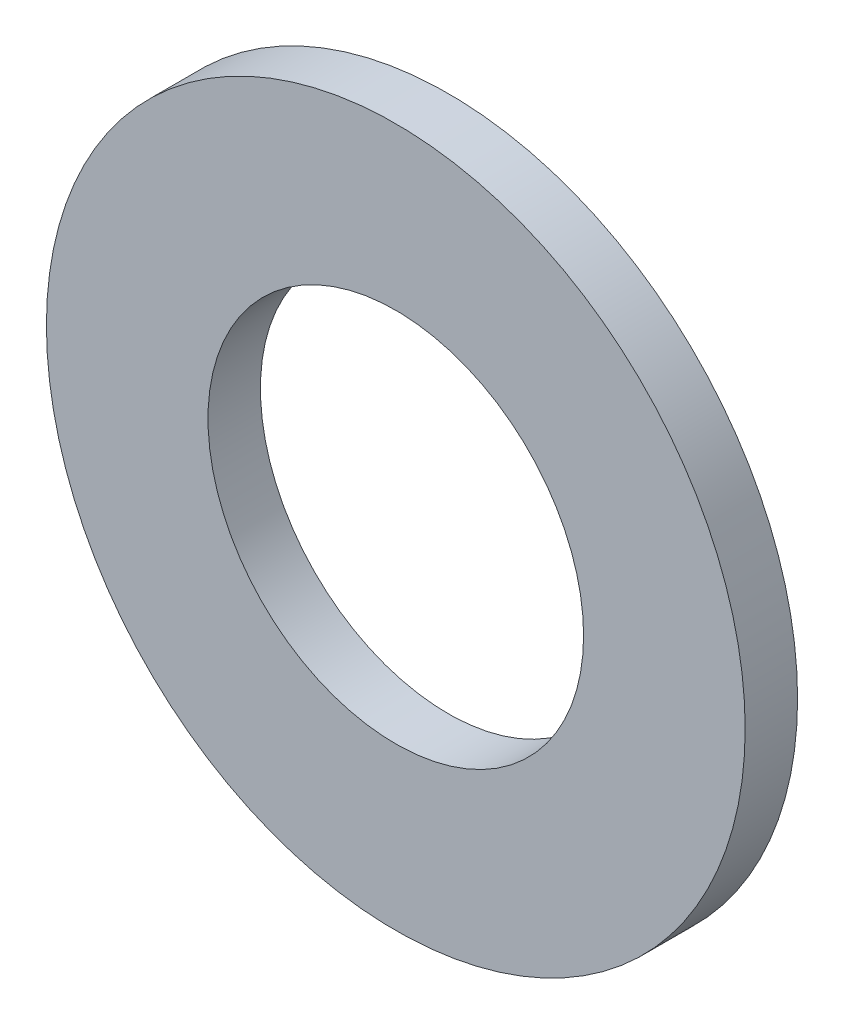
ISO-10303-21;
HEADER;
FILE_DESCRIPTION(('STEP AP214'),'2;1');
FILE_NAME('part.step','',(''),(''),'','','');
FILE_SCHEMA(('AUTOMOTIVE_DESIGN { 1 0 10303 214 1 1 1 1 }'));
ENDSEC;
DATA;
#1=APPLICATION_CONTEXT('core data for automotive mechanical design processes');
#2=APPLICATION_PROTOCOL_DEFINITION('international standard','automotive_design',2000,#1);
#3=PRODUCT_CONTEXT('',#1,'mechanical');
#4=PRODUCT('Part','Part','',(#3));
#5=PRODUCT_RELATED_PRODUCT_CATEGORY('part','',(#4));
#6=PRODUCT_DEFINITION_FORMATION('','',#4);
#7=PRODUCT_DEFINITION_CONTEXT('part definition',#1,'design');
#8=PRODUCT_DEFINITION('design','',#6,#7);
#9=PRODUCT_DEFINITION_SHAPE('','',#8);
#10=(LENGTH_UNIT() NAMED_UNIT(*) SI_UNIT(.MILLI.,.METRE.));
#11=(NAMED_UNIT(*) PLANE_ANGLE_UNIT() SI_UNIT($,.RADIAN.));
#12=(NAMED_UNIT(*) SI_UNIT($,.STERADIAN.) SOLID_ANGLE_UNIT());
#13=UNCERTAINTY_MEASURE_WITH_UNIT(LENGTH_MEASURE(1.E-05),#10,'distance_accuracy_value','');
#14=(GEOMETRIC_REPRESENTATION_CONTEXT(3) GLOBAL_UNCERTAINTY_ASSIGNED_CONTEXT((#13)) GLOBAL_UNIT_ASSIGNED_CONTEXT((#10,
#11,#12)) REPRESENTATION_CONTEXT('',''));
#15=CARTESIAN_POINT('',(0.,0.,0.));
#16=DIRECTION('',(0.,0.,1.));
#17=DIRECTION('',(1.,0.,0.));
#18=AXIS2_PLACEMENT_3D('',#15,#16,#17);
#19=CARTESIAN_POINT('',(0.,0.,0.299999999999999));
#20=DIRECTION('',(0.,0.,1.));
#21=DIRECTION('',(1.,0.,0.));
#22=AXIS2_PLACEMENT_3D('',#19,#20,#21);
#23=PLANE('',#22);
#24=CARTESIAN_POINT('',(0.,0.,0.299999999999999));
#25=DIRECTION('',(0.,0.,1.));
#26=DIRECTION('',(1.,0.,0.));
#27=AXIS2_PLACEMENT_3D('',#24,#25,#26);
#28=CIRCLE('',#27,4.);
#29=CARTESIAN_POINT('',(4.,0.,0.299999999999999));
#30=VERTEX_POINT('',#29);
#31=EDGE_CURVE('E10',#30,#30,#28,.T.);
#32=ORIENTED_EDGE('',*,*,#31,.T.);
#33=EDGE_LOOP('',(#32));
#34=FACE_BOUND('',#33,.T.);
#35=CARTESIAN_POINT('',(0.,0.,0.299999999999999));
#36=DIRECTION('',(0.,0.,1.));
#37=DIRECTION('',(1.,0.,0.));
#38=AXIS2_PLACEMENT_3D('',#35,#36,#37);
#39=CIRCLE('',#38,2.15);
#40=CARTESIAN_POINT('',(2.15,0.,0.299999999999999));
#41=VERTEX_POINT('',#40);
#42=EDGE_CURVE('E42',#41,#41,#39,.T.);
#43=ORIENTED_EDGE('',*,*,#42,.F.);
#44=EDGE_LOOP('',(#43));
#45=FACE_BOUND('',#44,.T.);
#46=ADVANCED_FACE('F34',(#34,#45),#23,.T.);
#47=CARTESIAN_POINT('',(0.,0.,0.299999999999999));
#48=DIRECTION('',(0.,0.,-1.));
#49=DIRECTION('',(-1.,0.,0.));
#50=AXIS2_PLACEMENT_3D('',#47,#48,#49);
#51=CYLINDRICAL_SURFACE('',#50,4.);
#52=ORIENTED_EDGE('',*,*,#31,.F.);
#53=EDGE_LOOP('',(#52));
#54=FACE_BOUND('',#53,.T.);
#55=CARTESIAN_POINT('',(0.,0.,-0.300000000000001));
#56=DIRECTION('',(0.,0.,1.));
#57=DIRECTION('',(1.,0.,0.));
#58=AXIS2_PLACEMENT_3D('',#55,#56,#57);
#59=CIRCLE('',#58,4.);
#60=CARTESIAN_POINT('',(4.,0.,-0.300000000000001));
#61=VERTEX_POINT('',#60);
#62=EDGE_CURVE('E48',#61,#61,#59,.T.);
#63=ORIENTED_EDGE('',*,*,#62,.T.);
#64=EDGE_LOOP('',(#63));
#65=FACE_BOUND('',#64,.T.);
#66=ADVANCED_FACE('F36',(#54,#65),#51,.T.);
#67=CARTESIAN_POINT('',(0.,0.,0.299999999999999));
#68=DIRECTION('',(0.,0.,-1.));
#69=DIRECTION('',(-1.,0.,0.));
#70=AXIS2_PLACEMENT_3D('',#67,#68,#69);
#71=CYLINDRICAL_SURFACE('',#70,2.15);
#72=ORIENTED_EDGE('',*,*,#42,.T.);
#73=EDGE_LOOP('',(#72));
#74=FACE_BOUND('',#73,.T.);
#75=CARTESIAN_POINT('',(0.,0.,-0.300000000000001));
#76=DIRECTION('',(0.,0.,1.));
#77=DIRECTION('',(1.,0.,0.));
#78=AXIS2_PLACEMENT_3D('',#75,#76,#77);
#79=CIRCLE('',#78,2.15);
#80=CARTESIAN_POINT('',(2.15,0.,-0.300000000000001));
#81=VERTEX_POINT('',#80);
#82=EDGE_CURVE('E53',#81,#81,#79,.T.);
#83=ORIENTED_EDGE('',*,*,#82,.F.);
#84=EDGE_LOOP('',(#83));
#85=FACE_BOUND('',#84,.T.);
#86=ADVANCED_FACE('F62',(#74,#85),#71,.F.);
#87=CARTESIAN_POINT('',(0.,0.,-0.300000000000001));
#88=DIRECTION('',(0.,0.,1.));
#89=DIRECTION('',(1.,0.,0.));
#90=AXIS2_PLACEMENT_3D('',#87,#88,#89);
#91=PLANE('',#90);
#92=ORIENTED_EDGE('',*,*,#82,.T.);
#93=EDGE_LOOP('',(#92));
#94=FACE_BOUND('',#93,.T.);
#95=ORIENTED_EDGE('',*,*,#62,.F.);
#96=EDGE_LOOP('',(#95));
#97=FACE_BOUND('',#96,.T.);
#98=ADVANCED_FACE('F59',(#94,#97),#91,.F.);
#99=CLOSED_SHELL('',(#46,#66,#86,#98));
#100=MANIFOLD_SOLID_BREP('B2',#99);
#101=ADVANCED_BREP_SHAPE_REPRESENTATION('',(#18,#100),#14);
#102=SHAPE_DEFINITION_REPRESENTATION(#9,#101);
ENDSEC;
END-ISO-10303-21;
